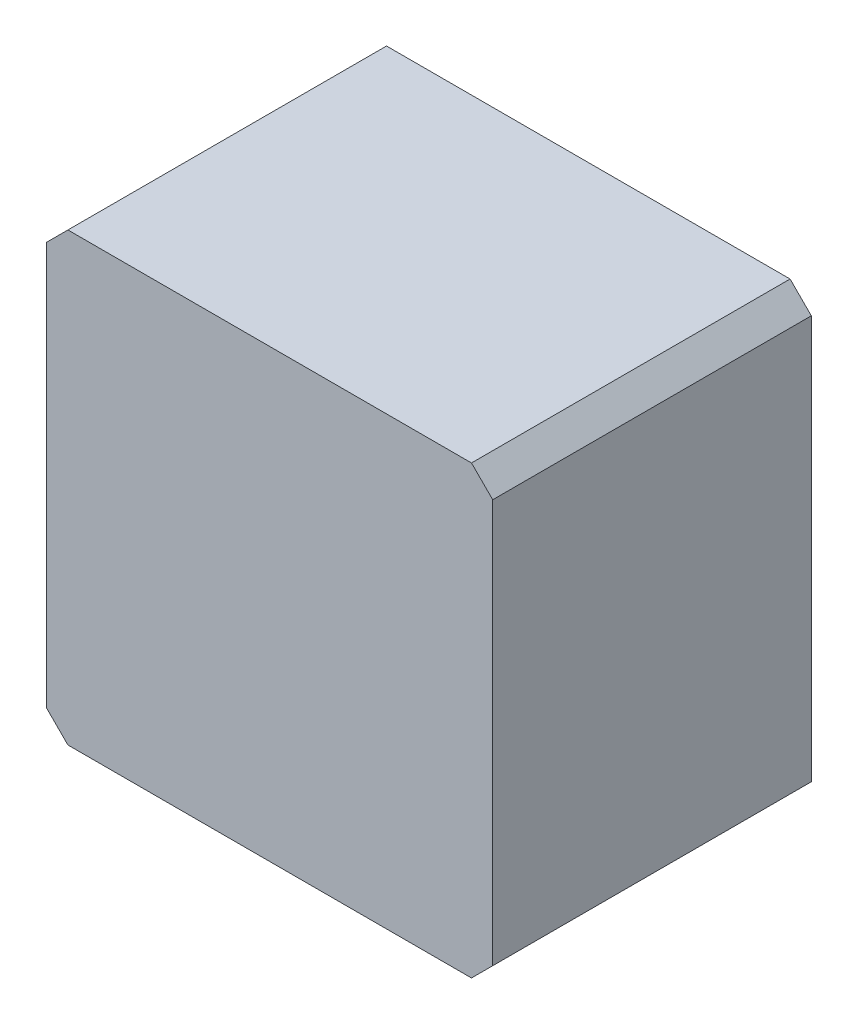
ISO-10303-21;
HEADER;
FILE_DESCRIPTION(('STEP AP214'),'2;1');
FILE_NAME('part.step','',(''),(''),'','','');
FILE_SCHEMA(('AUTOMOTIVE_DESIGN { 1 0 10303 214 1 1 1 1 }'));
ENDSEC;
DATA;
#1=APPLICATION_CONTEXT('core data for automotive mechanical design processes');
#2=APPLICATION_PROTOCOL_DEFINITION('international standard','automotive_design',2000,#1);
#3=PRODUCT_CONTEXT('',#1,'mechanical');
#4=PRODUCT('Part','Part','',(#3));
#5=PRODUCT_RELATED_PRODUCT_CATEGORY('part','',(#4));
#6=PRODUCT_DEFINITION_FORMATION('','',#4);
#7=PRODUCT_DEFINITION_CONTEXT('part definition',#1,'design');
#8=PRODUCT_DEFINITION('design','',#6,#7);
#9=PRODUCT_DEFINITION_SHAPE('','',#8);
#10=(LENGTH_UNIT() NAMED_UNIT(*) SI_UNIT(.MILLI.,.METRE.));
#11=(NAMED_UNIT(*) PLANE_ANGLE_UNIT() SI_UNIT($,.RADIAN.));
#12=(NAMED_UNIT(*) SI_UNIT($,.STERADIAN.) SOLID_ANGLE_UNIT());
#13=UNCERTAINTY_MEASURE_WITH_UNIT(LENGTH_MEASURE(1.E-05),#10,'distance_accuracy_value','');
#14=(GEOMETRIC_REPRESENTATION_CONTEXT(3) GLOBAL_UNCERTAINTY_ASSIGNED_CONTEXT((#13)) GLOBAL_UNIT_ASSIGNED_CONTEXT((#10,
#11,#12)) REPRESENTATION_CONTEXT('',''));
#15=CARTESIAN_POINT('',(0.,0.,0.));
#16=DIRECTION('',(0.,0.,1.));
#17=DIRECTION('',(1.,0.,0.));
#18=AXIS2_PLACEMENT_3D('',#15,#16,#17);
#19=CARTESIAN_POINT('',(-19.,21.,30.));
#20=DIRECTION('',(0.,-1.,0.));
#21=DIRECTION('',(1.,0.,0.));
#22=AXIS2_PLACEMENT_3D('',#19,#20,#21);
#23=PLANE('',#22);
#24=DIRECTION('',(-1.,0.,0.));
#25=VECTOR('',#24,1.);
#26=CARTESIAN_POINT('',(-19.,21.,0.));
#27=LINE('',#26,#25);
#28=CARTESIAN_POINT('',(19.,21.,0.));
#29=VERTEX_POINT('',#28);
#30=CARTESIAN_POINT('',(-19.,21.,0.));
#31=VERTEX_POINT('',#30);
#32=EDGE_CURVE('E128',#29,#31,#27,.T.);
#33=ORIENTED_EDGE('',*,*,#32,.T.);
#34=DIRECTION('',(0.,0.,-1.));
#35=VECTOR('',#34,1.);
#36=CARTESIAN_POINT('',(-19.,21.,30.));
#37=LINE('',#36,#35);
#38=CARTESIAN_POINT('',(-19.,21.,30.));
#39=VERTEX_POINT('',#38);
#40=EDGE_CURVE('E11',#39,#31,#37,.T.);
#41=ORIENTED_EDGE('',*,*,#40,.F.);
#42=DIRECTION('',(-1.,0.,0.));
#43=VECTOR('',#42,1.);
#44=CARTESIAN_POINT('',(-19.,21.,30.));
#45=LINE('',#44,#43);
#46=CARTESIAN_POINT('',(19.,21.,30.));
#47=VERTEX_POINT('',#46);
#48=EDGE_CURVE('E142',#47,#39,#45,.T.);
#49=ORIENTED_EDGE('',*,*,#48,.F.);
#50=DIRECTION('',(0.,0.,-1.));
#51=VECTOR('',#50,1.);
#52=CARTESIAN_POINT('',(19.,21.,30.));
#53=LINE('',#52,#51);
#54=EDGE_CURVE('E124',#47,#29,#53,.T.);
#55=ORIENTED_EDGE('',*,*,#54,.T.);
#56=EDGE_LOOP('',(#33,#41,#49,#55));
#57=FACE_BOUND('',#56,.T.);
#58=ADVANCED_FACE('F32',(#57),#23,.F.);
#59=CARTESIAN_POINT('',(-21.,19.,30.));
#60=DIRECTION('',(0.707106781186547,-0.707106781186547,0.));
#61=DIRECTION('',(0.707106781186548,0.707106781186548,0.));
#62=AXIS2_PLACEMENT_3D('',#59,#60,#61);
#63=PLANE('',#62);
#64=DIRECTION('',(-0.707106781186547,-0.707106781186547,0.));
#65=VECTOR('',#64,1.);
#66=CARTESIAN_POINT('',(-21.,19.,0.));
#67=LINE('',#66,#65);
#68=CARTESIAN_POINT('',(-21.,19.,0.));
#69=VERTEX_POINT('',#68);
#70=EDGE_CURVE('E131',#31,#69,#67,.T.);
#71=ORIENTED_EDGE('',*,*,#70,.T.);
#72=DIRECTION('',(0.,0.,-1.));
#73=VECTOR('',#72,1.);
#74=CARTESIAN_POINT('',(-21.,19.,30.));
#75=LINE('',#74,#73);
#76=CARTESIAN_POINT('',(-21.,19.,30.));
#77=VERTEX_POINT('',#76);
#78=EDGE_CURVE('E40',#77,#69,#75,.T.);
#79=ORIENTED_EDGE('',*,*,#78,.F.);
#80=DIRECTION('',(-0.707106781186547,-0.707106781186547,0.));
#81=VECTOR('',#80,1.);
#82=CARTESIAN_POINT('',(-21.,19.,30.));
#83=LINE('',#82,#81);
#84=EDGE_CURVE('E91',#39,#77,#83,.T.);
#85=ORIENTED_EDGE('',*,*,#84,.F.);
#86=ORIENTED_EDGE('',*,*,#40,.T.);
#87=EDGE_LOOP('',(#71,#79,#85,#86));
#88=FACE_BOUND('',#87,.T.);
#89=ADVANCED_FACE('F177',(#88),#63,.F.);
#90=CARTESIAN_POINT('',(-21.,19.,30.));
#91=DIRECTION('',(1.,0.,0.));
#92=DIRECTION('',(0.,1.,0.));
#93=AXIS2_PLACEMENT_3D('',#90,#91,#92);
#94=PLANE('',#93);
#95=DIRECTION('',(0.,-1.,0.));
#96=VECTOR('',#95,1.);
#97=CARTESIAN_POINT('',(-21.,19.,0.));
#98=LINE('',#97,#96);
#99=CARTESIAN_POINT('',(-21.,-19.,0.));
#100=VERTEX_POINT('',#99);
#101=EDGE_CURVE('E133',#69,#100,#98,.T.);
#102=ORIENTED_EDGE('',*,*,#101,.T.);
#103=DIRECTION('',(0.,0.,-1.));
#104=VECTOR('',#103,1.);
#105=CARTESIAN_POINT('',(-21.,-19.,30.));
#106=LINE('',#105,#104);
#107=CARTESIAN_POINT('',(-21.,-19.,30.));
#108=VERTEX_POINT('',#107);
#109=EDGE_CURVE('E149',#108,#100,#106,.T.);
#110=ORIENTED_EDGE('',*,*,#109,.F.);
#111=DIRECTION('',(0.,-1.,0.));
#112=VECTOR('',#111,1.);
#113=CARTESIAN_POINT('',(-21.,19.,30.));
#114=LINE('',#113,#112);
#115=EDGE_CURVE('E157',#77,#108,#114,.T.);
#116=ORIENTED_EDGE('',*,*,#115,.F.);
#117=ORIENTED_EDGE('',*,*,#78,.T.);
#118=EDGE_LOOP('',(#102,#110,#116,#117));
#119=FACE_BOUND('',#118,.T.);
#120=ADVANCED_FACE('F155',(#119),#94,.F.);
#121=CARTESIAN_POINT('',(-21.,-19.,30.));
#122=DIRECTION('',(0.707106781186548,0.707106781186547,0.));
#123=DIRECTION('',(-0.707106781186547,0.707106781186548,0.));
#124=AXIS2_PLACEMENT_3D('',#121,#122,#123);
#125=PLANE('',#124);
#126=DIRECTION('',(0.707106781186547,-0.707106781186548,0.));
#127=VECTOR('',#126,1.);
#128=CARTESIAN_POINT('',(-21.,-19.,0.));
#129=LINE('',#128,#127);
#130=CARTESIAN_POINT('',(-19.,-21.,0.));
#131=VERTEX_POINT('',#130);
#132=EDGE_CURVE('E135',#100,#131,#129,.T.);
#133=ORIENTED_EDGE('',*,*,#132,.T.);
#134=DIRECTION('',(0.,0.,-1.));
#135=VECTOR('',#134,1.);
#136=CARTESIAN_POINT('',(-19.,-21.,30.));
#137=LINE('',#136,#135);
#138=CARTESIAN_POINT('',(-19.,-21.,30.));
#139=VERTEX_POINT('',#138);
#140=EDGE_CURVE('E146',#139,#131,#137,.T.);
#141=ORIENTED_EDGE('',*,*,#140,.F.);
#142=DIRECTION('',(0.707106781186547,-0.707106781186548,0.));
#143=VECTOR('',#142,1.);
#144=CARTESIAN_POINT('',(-21.,-19.,30.));
#145=LINE('',#144,#143);
#146=EDGE_CURVE('E169',#108,#139,#145,.T.);
#147=ORIENTED_EDGE('',*,*,#146,.F.);
#148=ORIENTED_EDGE('',*,*,#109,.T.);
#149=EDGE_LOOP('',(#133,#141,#147,#148));
#150=FACE_BOUND('',#149,.T.);
#151=ADVANCED_FACE('F165',(#150),#125,.F.);
#152=CARTESIAN_POINT('',(-19.,-21.,30.));
#153=DIRECTION('',(0.,1.,0.));
#154=DIRECTION('',(0.,0.,1.));
#155=AXIS2_PLACEMENT_3D('',#152,#153,#154);
#156=PLANE('',#155);
#157=DIRECTION('',(1.,0.,0.));
#158=VECTOR('',#157,1.);
#159=CARTESIAN_POINT('',(-19.,-21.,0.));
#160=LINE('',#159,#158);
#161=CARTESIAN_POINT('',(19.,-21.,0.));
#162=VERTEX_POINT('',#161);
#163=EDGE_CURVE('E137',#131,#162,#160,.T.);
#164=ORIENTED_EDGE('',*,*,#163,.T.);
#165=DIRECTION('',(0.,0.,-1.));
#166=VECTOR('',#165,1.);
#167=CARTESIAN_POINT('',(19.,-21.,30.));
#168=LINE('',#167,#166);
#169=CARTESIAN_POINT('',(19.,-21.,30.));
#170=VERTEX_POINT('',#169);
#171=EDGE_CURVE('E119',#170,#162,#168,.T.);
#172=ORIENTED_EDGE('',*,*,#171,.F.);
#173=DIRECTION('',(1.,0.,0.));
#174=VECTOR('',#173,1.);
#175=CARTESIAN_POINT('',(-19.,-21.,30.));
#176=LINE('',#175,#174);
#177=EDGE_CURVE('E110',#139,#170,#176,.T.);
#178=ORIENTED_EDGE('',*,*,#177,.F.);
#179=ORIENTED_EDGE('',*,*,#140,.T.);
#180=EDGE_LOOP('',(#164,#172,#178,#179));
#181=FACE_BOUND('',#180,.T.);
#182=ADVANCED_FACE('F168',(#181),#156,.F.);
#183=CARTESIAN_POINT('',(21.,-19.,30.));
#184=DIRECTION('',(-0.707106781186548,0.707106781186547,0.));
#185=DIRECTION('',(-0.707106781186547,-0.707106781186548,0.));
#186=AXIS2_PLACEMENT_3D('',#183,#184,#185);
#187=PLANE('',#186);
#188=DIRECTION('',(0.707106781186547,0.707106781186548,0.));
#189=VECTOR('',#188,1.);
#190=CARTESIAN_POINT('',(21.,-19.,0.));
#191=LINE('',#190,#189);
#192=CARTESIAN_POINT('',(21.,-19.,0.));
#193=VERTEX_POINT('',#192);
#194=EDGE_CURVE('E118',#162,#193,#191,.T.);
#195=ORIENTED_EDGE('',*,*,#194,.T.);
#196=DIRECTION('',(0.,0.,-1.));
#197=VECTOR('',#196,1.);
#198=CARTESIAN_POINT('',(21.,-19.,30.));
#199=LINE('',#198,#197);
#200=CARTESIAN_POINT('',(21.,-19.,30.));
#201=VERTEX_POINT('',#200);
#202=EDGE_CURVE('E115',#201,#193,#199,.T.);
#203=ORIENTED_EDGE('',*,*,#202,.F.);
#204=DIRECTION('',(0.707106781186547,0.707106781186548,0.));
#205=VECTOR('',#204,1.);
#206=CARTESIAN_POINT('',(21.,-19.,30.));
#207=LINE('',#206,#205);
#208=EDGE_CURVE('E104',#170,#201,#207,.T.);
#209=ORIENTED_EDGE('',*,*,#208,.F.);
#210=ORIENTED_EDGE('',*,*,#171,.T.);
#211=EDGE_LOOP('',(#195,#203,#209,#210));
#212=FACE_BOUND('',#211,.T.);
#213=ADVANCED_FACE('F116',(#212),#187,.F.);
#214=CARTESIAN_POINT('',(21.,19.,30.));
#215=DIRECTION('',(-1.,0.,0.));
#216=DIRECTION('',(0.,-1.,0.));
#217=AXIS2_PLACEMENT_3D('',#214,#215,#216);
#218=PLANE('',#217);
#219=DIRECTION('',(0.,1.,0.));
#220=VECTOR('',#219,1.);
#221=CARTESIAN_POINT('',(21.,19.,0.));
#222=LINE('',#221,#220);
#223=CARTESIAN_POINT('',(21.,19.,0.));
#224=VERTEX_POINT('',#223);
#225=EDGE_CURVE('E77',#193,#224,#222,.T.);
#226=ORIENTED_EDGE('',*,*,#225,.T.);
#227=DIRECTION('',(0.,0.,-1.));
#228=VECTOR('',#227,1.);
#229=CARTESIAN_POINT('',(21.,19.,30.));
#230=LINE('',#229,#228);
#231=CARTESIAN_POINT('',(21.,19.,30.));
#232=VERTEX_POINT('',#231);
#233=EDGE_CURVE('E120',#232,#224,#230,.T.);
#234=ORIENTED_EDGE('',*,*,#233,.F.);
#235=DIRECTION('',(0.,1.,0.));
#236=VECTOR('',#235,1.);
#237=CARTESIAN_POINT('',(21.,19.,30.));
#238=LINE('',#237,#236);
#239=EDGE_CURVE('E108',#201,#232,#238,.T.);
#240=ORIENTED_EDGE('',*,*,#239,.F.);
#241=ORIENTED_EDGE('',*,*,#202,.T.);
#242=EDGE_LOOP('',(#226,#234,#240,#241));
#243=FACE_BOUND('',#242,.T.);
#244=ADVANCED_FACE('F122',(#243),#218,.F.);
#245=CARTESIAN_POINT('',(19.,21.,30.));
#246=DIRECTION('',(-0.707106781186548,-0.707106781186547,0.));
#247=DIRECTION('',(0.707106781186547,-0.707106781186548,0.));
#248=AXIS2_PLACEMENT_3D('',#245,#246,#247);
#249=PLANE('',#248);
#250=DIRECTION('',(-0.707106781186547,0.707106781186548,0.));
#251=VECTOR('',#250,1.);
#252=CARTESIAN_POINT('',(19.,21.,0.));
#253=LINE('',#252,#251);
#254=EDGE_CURVE('E83',#224,#29,#253,.T.);
#255=ORIENTED_EDGE('',*,*,#254,.T.);
#256=ORIENTED_EDGE('',*,*,#54,.F.);
#257=DIRECTION('',(-0.707106781186547,0.707106781186548,0.));
#258=VECTOR('',#257,1.);
#259=CARTESIAN_POINT('',(19.,21.,30.));
#260=LINE('',#259,#258);
#261=EDGE_CURVE('E48',#232,#47,#260,.T.);
#262=ORIENTED_EDGE('',*,*,#261,.F.);
#263=ORIENTED_EDGE('',*,*,#233,.T.);
#264=EDGE_LOOP('',(#255,#256,#262,#263));
#265=FACE_BOUND('',#264,.T.);
#266=ADVANCED_FACE('F193',(#265),#249,.F.);
#267=CARTESIAN_POINT('',(0.,0.,30.));
#268=DIRECTION('',(0.,0.,-1.));
#269=DIRECTION('',(-1.,0.,0.));
#270=AXIS2_PLACEMENT_3D('',#267,#268,#269);
#271=PLANE('',#270);
#272=ORIENTED_EDGE('',*,*,#48,.T.);
#273=ORIENTED_EDGE('',*,*,#84,.T.);
#274=ORIENTED_EDGE('',*,*,#115,.T.);
#275=ORIENTED_EDGE('',*,*,#146,.T.);
#276=ORIENTED_EDGE('',*,*,#177,.T.);
#277=ORIENTED_EDGE('',*,*,#208,.T.);
#278=ORIENTED_EDGE('',*,*,#239,.T.);
#279=ORIENTED_EDGE('',*,*,#261,.T.);
#280=EDGE_LOOP('',(#272,#273,#274,#275,#276,#277,#278,#279));
#281=FACE_BOUND('',#280,.T.);
#282=ADVANCED_FACE('F106',(#281),#271,.F.);
#283=CARTESIAN_POINT('',(0.,0.,0.));
#284=DIRECTION('',(0.,0.,-1.));
#285=DIRECTION('',(-1.,0.,0.));
#286=AXIS2_PLACEMENT_3D('',#283,#284,#285);
#287=PLANE('',#286);
#288=ORIENTED_EDGE('',*,*,#32,.F.);
#289=ORIENTED_EDGE('',*,*,#254,.F.);
#290=ORIENTED_EDGE('',*,*,#225,.F.);
#291=ORIENTED_EDGE('',*,*,#194,.F.);
#292=ORIENTED_EDGE('',*,*,#163,.F.);
#293=ORIENTED_EDGE('',*,*,#132,.F.);
#294=ORIENTED_EDGE('',*,*,#101,.F.);
#295=ORIENTED_EDGE('',*,*,#70,.F.);
#296=EDGE_LOOP('',(#288,#289,#290,#291,#292,#293,#294,#295));
#297=FACE_BOUND('',#296,.T.);
#298=ADVANCED_FACE('F161',(#297),#287,.T.);
#299=CLOSED_SHELL('',(#58,#89,#120,#151,#182,#213,#244,#266,#282,#298));
#300=MANIFOLD_SOLID_BREP('B2',#299);
#301=ADVANCED_BREP_SHAPE_REPRESENTATION('',(#18,#300),#14);
#302=SHAPE_DEFINITION_REPRESENTATION(#9,#301);
ENDSEC;
END-ISO-10303-21;
